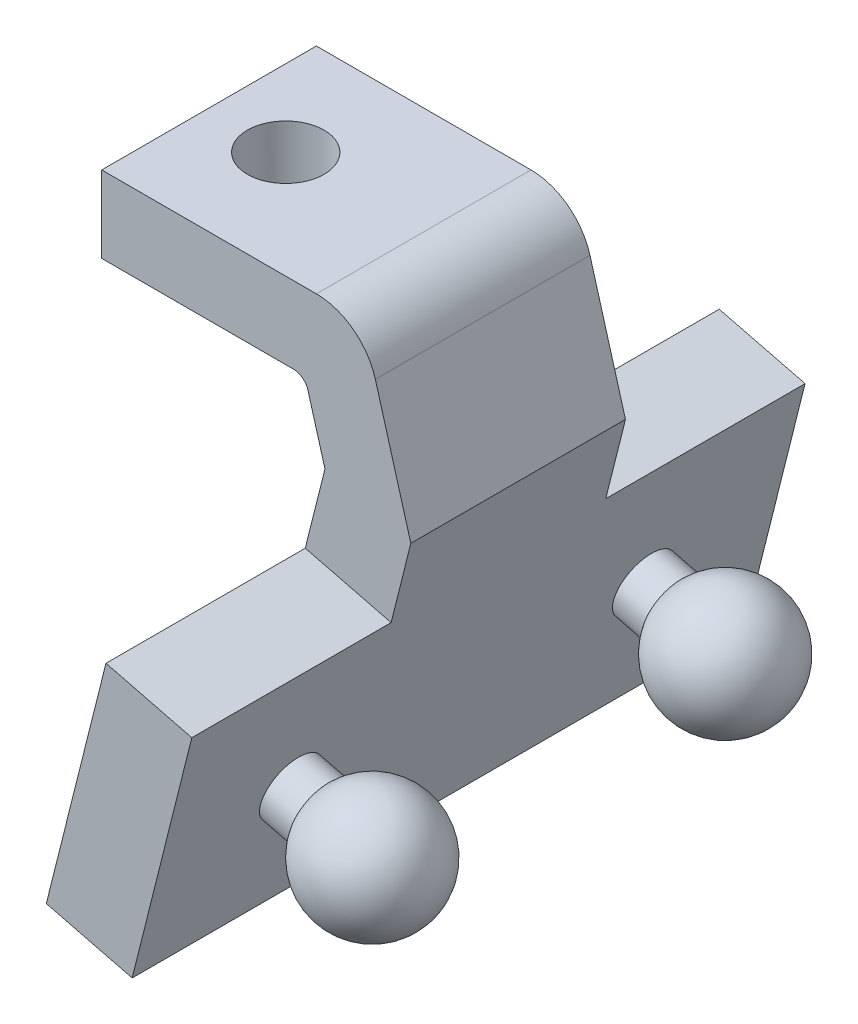
ISO-10303-21;
HEADER;
FILE_DESCRIPTION(('STEP AP214'),'2;1');
FILE_NAME('part.step','',(''),(''),'','','');
FILE_SCHEMA(('AUTOMOTIVE_DESIGN { 1 0 10303 214 1 1 1 1 }'));
ENDSEC;
DATA;
#1=APPLICATION_CONTEXT('core data for automotive mechanical design processes');
#2=APPLICATION_PROTOCOL_DEFINITION('international standard','automotive_design',2000,#1);
#3=PRODUCT_CONTEXT('',#1,'mechanical');
#4=PRODUCT('Part','Part','',(#3));
#5=PRODUCT_RELATED_PRODUCT_CATEGORY('part','',(#4));
#6=PRODUCT_DEFINITION_FORMATION('','',#4);
#7=PRODUCT_DEFINITION_CONTEXT('part definition',#1,'design');
#8=PRODUCT_DEFINITION('design','',#6,#7);
#9=PRODUCT_DEFINITION_SHAPE('','',#8);
#10=(LENGTH_UNIT() NAMED_UNIT(*) SI_UNIT(.MILLI.,.METRE.));
#11=(NAMED_UNIT(*) PLANE_ANGLE_UNIT() SI_UNIT($,.RADIAN.));
#12=(NAMED_UNIT(*) SI_UNIT($,.STERADIAN.) SOLID_ANGLE_UNIT());
#13=UNCERTAINTY_MEASURE_WITH_UNIT(LENGTH_MEASURE(1.E-05),#10,'distance_accuracy_value','');
#14=(GEOMETRIC_REPRESENTATION_CONTEXT(3) GLOBAL_UNCERTAINTY_ASSIGNED_CONTEXT((#13)) GLOBAL_UNIT_ASSIGNED_CONTEXT((#10,
#11,#12)) REPRESENTATION_CONTEXT('',''));
#15=CARTESIAN_POINT('',(0.,0.,0.));
#16=DIRECTION('',(0.,0.,1.));
#17=DIRECTION('',(1.,0.,0.));
#18=AXIS2_PLACEMENT_3D('',#15,#16,#17);
#19=CARTESIAN_POINT('',(0.,0.,3.5));
#20=DIRECTION('',(1.,0.,0.));
#21=DIRECTION('',(0.,0.,-1.));
#22=AXIS2_PLACEMENT_3D('',#19,#20,#21);
#23=PLANE('',#22);
#24=DIRECTION('',(0.,-1.,0.));
#25=VECTOR('',#24,1.);
#26=CARTESIAN_POINT('',(0.,0.,-3.5));
#27=LINE('',#26,#25);
#28=CARTESIAN_POINT('',(0.,2.5,-3.5));
#29=VERTEX_POINT('',#28);
#30=CARTESIAN_POINT('',(0.,0.,-3.5));
#31=VERTEX_POINT('',#30);
#32=EDGE_CURVE('E212',#29,#31,#27,.T.);
#33=ORIENTED_EDGE('',*,*,#32,.T.);
#34=DIRECTION('',(0.,0.,-1.));
#35=VECTOR('',#34,1.);
#36=CARTESIAN_POINT('',(0.,0.,3.5));
#37=LINE('',#36,#35);
#38=CARTESIAN_POINT('',(0.,0.,3.5));
#39=VERTEX_POINT('',#38);
#40=EDGE_CURVE('E252',#39,#31,#37,.T.);
#41=ORIENTED_EDGE('',*,*,#40,.F.);
#42=DIRECTION('',(0.,-1.,0.));
#43=VECTOR('',#42,1.);
#44=CARTESIAN_POINT('',(0.,0.,3.5));
#45=LINE('',#44,#43);
#46=CARTESIAN_POINT('',(0.,2.5,3.5));
#47=VERTEX_POINT('',#46);
#48=EDGE_CURVE('E192',#47,#39,#45,.T.);
#49=ORIENTED_EDGE('',*,*,#48,.F.);
#50=DIRECTION('',(0.,0.,-1.));
#51=VECTOR('',#50,1.);
#52=CARTESIAN_POINT('',(0.,2.5,3.5));
#53=LINE('',#52,#51);
#54=EDGE_CURVE('E211',#47,#29,#53,.T.);
#55=ORIENTED_EDGE('',*,*,#54,.T.);
#56=EDGE_LOOP('',(#33,#41,#49,#55));
#57=FACE_BOUND('',#56,.T.);
#58=ADVANCED_FACE('F41',(#57),#23,.F.);
#59=CARTESIAN_POINT('',(0.,0.,3.5));
#60=DIRECTION('',(0.,1.,0.));
#61=DIRECTION('',(0.,0.,1.));
#62=AXIS2_PLACEMENT_3D('',#59,#60,#61);
#63=PLANE('',#62);
#64=CARTESIAN_POINT('',(2.5,0.,0.));
#65=DIRECTION('',(0.,-1.,0.));
#66=DIRECTION('',(1.,0.,0.));
#67=AXIS2_PLACEMENT_3D('',#64,#65,#66);
#68=CIRCLE('',#67,1.25);
#69=CARTESIAN_POINT('',(3.75,0.,0.));
#70=VERTEX_POINT('',#69);
#71=EDGE_CURVE('E188',#70,#70,#68,.T.);
#72=ORIENTED_EDGE('',*,*,#71,.F.);
#73=EDGE_LOOP('',(#72));
#74=FACE_BOUND('',#73,.T.);
#75=DIRECTION('',(1.,0.,0.));
#76=VECTOR('',#75,1.);
#77=CARTESIAN_POINT('',(0.,0.,-3.5));
#78=LINE('',#77,#76);
#79=CARTESIAN_POINT('',(6.24543275290352,0.,-3.5));
#80=VERTEX_POINT('',#79);
#81=EDGE_CURVE('E215',#31,#80,#78,.T.);
#82=ORIENTED_EDGE('',*,*,#81,.T.);
#83=DIRECTION('',(0.,0.,-1.));
#84=VECTOR('',#83,1.);
#85=CARTESIAN_POINT('',(6.24543275290352,0.,3.5));
#86=LINE('',#85,#84);
#87=CARTESIAN_POINT('',(6.24543275290352,0.,3.5));
#88=VERTEX_POINT('',#87);
#89=EDGE_CURVE('E249',#88,#80,#86,.T.);
#90=ORIENTED_EDGE('',*,*,#89,.F.);
#91=DIRECTION('',(1.,0.,0.));
#92=VECTOR('',#91,1.);
#93=CARTESIAN_POINT('',(0.,0.,3.5));
#94=LINE('',#93,#92);
#95=EDGE_CURVE('E195',#39,#88,#94,.T.);
#96=ORIENTED_EDGE('',*,*,#95,.F.);
#97=ORIENTED_EDGE('',*,*,#40,.T.);
#98=EDGE_LOOP('',(#82,#90,#96,#97));
#99=FACE_BOUND('',#98,.T.);
#100=ADVANCED_FACE('F295',(#74,#99),#63,.F.);
#101=CARTESIAN_POINT('',(6.24543275290367,-0.5,3.5));
#102=DIRECTION('',(0.,0.,-1.));
#103=DIRECTION('',(-1.,0.,0.));
#104=AXIS2_PLACEMENT_3D('',#101,#102,#103);
#105=CYLINDRICAL_SURFACE('',#104,0.499999999999928);
#106=CARTESIAN_POINT('',(6.24543275290367,-0.5,-3.5));
#107=DIRECTION('',(0.,0.,-1.));
#108=DIRECTION('',(-1.,0.,0.));
#109=AXIS2_PLACEMENT_3D('',#106,#107,#108);
#110=CIRCLE('',#109,0.499999999999928);
#111=CARTESIAN_POINT('',(6.72624123981867,-0.362802336352115,-3.5));
#112=VERTEX_POINT('',#111);
#113=EDGE_CURVE('E217',#80,#112,#110,.T.);
#114=ORIENTED_EDGE('',*,*,#113,.T.);
#115=DIRECTION('',(0.,0.,-1.));
#116=VECTOR('',#115,1.);
#117=CARTESIAN_POINT('',(6.72624123981867,-0.362802336352115,3.5));
#118=LINE('',#117,#116);
#119=CARTESIAN_POINT('',(6.72624123981867,-0.362802336352115,3.5));
#120=VERTEX_POINT('',#119);
#121=EDGE_CURVE('E246',#120,#112,#118,.T.);
#122=ORIENTED_EDGE('',*,*,#121,.F.);
#123=CARTESIAN_POINT('',(6.24543275290367,-0.5,3.5));
#124=DIRECTION('',(0.,0.,-1.));
#125=DIRECTION('',(-1.,0.,0.));
#126=AXIS2_PLACEMENT_3D('',#123,#124,#125);
#127=CIRCLE('',#126,0.499999999999928);
#128=EDGE_CURVE('E198',#88,#120,#127,.T.);
#129=ORIENTED_EDGE('',*,*,#128,.F.);
#130=ORIENTED_EDGE('',*,*,#89,.T.);
#131=EDGE_LOOP('',(#114,#122,#129,#130));
#132=FACE_BOUND('',#131,.T.);
#133=ADVANCED_FACE('F291',(#132),#105,.F.);
#134=CARTESIAN_POINT('',(6.7262412398186,-0.362802336352134,3.5));
#135=DIRECTION('',(0.961616973830156,0.274395327295733,0.));
#136=DIRECTION('',(-0.274395327295733,0.961616973830156,0.));
#137=AXIS2_PLACEMENT_3D('',#134,#135,#136);
#138=PLANE('',#137);
#139=DIRECTION('',(0.274395327295733,-0.961616973830156,0.));
#140=VECTOR('',#139,1.);
#141=CARTESIAN_POINT('',(6.7262412398186,-0.362802336352134,-3.5));
#142=LINE('',#141,#140);
#143=CARTESIAN_POINT('',(7.28017081267278,-2.30404559589561,-3.5));
#144=VERTEX_POINT('',#143);
#145=EDGE_CURVE('E219',#112,#144,#142,.T.);
#146=ORIENTED_EDGE('',*,*,#145,.T.);
#147=DIRECTION('',(0.,0.,-1.));
#148=VECTOR('',#147,1.);
#149=CARTESIAN_POINT('',(7.28017081267278,-2.30404559589561,3.5));
#150=LINE('',#149,#148);
#151=CARTESIAN_POINT('',(7.28017081267278,-2.30404559589561,3.5));
#152=VERTEX_POINT('',#151);
#153=EDGE_CURVE('E244',#152,#144,#150,.T.);
#154=ORIENTED_EDGE('',*,*,#153,.F.);
#155=DIRECTION('',(0.274395327295733,-0.961616973830156,0.));
#156=VECTOR('',#155,1.);
#157=CARTESIAN_POINT('',(6.7262412398186,-0.362802336352134,3.5));
#158=LINE('',#157,#156);
#159=EDGE_CURVE('E200',#120,#152,#158,.T.);
#160=ORIENTED_EDGE('',*,*,#159,.F.);
#161=ORIENTED_EDGE('',*,*,#121,.T.);
#162=EDGE_LOOP('',(#146,#154,#160,#161));
#163=FACE_BOUND('',#162,.T.);
#164=ADVANCED_FACE('F286',(#163),#138,.F.);
#165=CARTESIAN_POINT('',(7.28017081267278,-2.30404559589561,3.5));
#166=DIRECTION('',(0.969982391695104,-0.243175162797203,0.));
#167=DIRECTION('',(0.243175162797203,0.969982391695104,0.));
#168=AXIS2_PLACEMENT_3D('',#165,#166,#167);
#169=PLANE('',#168);
#170=DIRECTION('',(-0.243175162797203,-0.969982391695104,0.));
#171=VECTOR('',#170,1.);
#172=CARTESIAN_POINT('',(7.28017081267278,-2.30404559589561,-3.5));
#173=LINE('',#172,#171);
#174=CARTESIAN_POINT('',(6.63821960289719,-4.86467457891787,-3.5));
#175=VERTEX_POINT('',#174);
#176=EDGE_CURVE('E159',#144,#175,#173,.T.);
#177=ORIENTED_EDGE('',*,*,#176,.T.);
#178=DIRECTION('',(0.,0.,1.));
#179=VECTOR('',#178,1.);
#180=CARTESIAN_POINT('',(6.63821960289719,-4.86467457891787,10.));
#181=LINE('',#180,#179);
#182=CARTESIAN_POINT('',(6.63821960289719,-4.86467457891787,-10.));
#183=VERTEX_POINT('',#182);
#184=EDGE_CURVE('E144',#183,#175,#181,.T.);
#185=ORIENTED_EDGE('',*,*,#184,.F.);
#186=DIRECTION('',(0.243175162797199,0.969982391695105,0.));
#187=VECTOR('',#186,1.);
#188=CARTESIAN_POINT('',(6.63821960289719,-4.86467457891787,-10.));
#189=LINE('',#188,#187);
#190=CARTESIAN_POINT('',(4.69281830051961,-12.6245337124787,-10.));
#191=VERTEX_POINT('',#190);
#192=EDGE_CURVE('E156',#191,#183,#189,.T.);
#193=ORIENTED_EDGE('',*,*,#192,.F.);
#194=DIRECTION('',(0.,0.,-1.));
#195=VECTOR('',#194,1.);
#196=CARTESIAN_POINT('',(4.69281830051958,-12.6245337124787,3.5));
#197=LINE('',#196,#195);
#198=CARTESIAN_POINT('',(4.69281830051961,-12.6245337124787,10.));
#199=VERTEX_POINT('',#198);
#200=EDGE_CURVE('E242',#199,#191,#197,.T.);
#201=ORIENTED_EDGE('',*,*,#200,.F.);
#202=DIRECTION('',(-0.243175162797199,-0.969982391695105,0.));
#203=VECTOR('',#202,1.);
#204=CARTESIAN_POINT('',(6.63821960289719,-4.86467457891787,10.));
#205=LINE('',#204,#203);
#206=CARTESIAN_POINT('',(6.63821960289719,-4.86467457891787,10.));
#207=VERTEX_POINT('',#206);
#208=EDGE_CURVE('E150',#207,#199,#205,.T.);
#209=ORIENTED_EDGE('',*,*,#208,.F.);
#210=CARTESIAN_POINT('',(6.63821960289721,-4.86467457891787,3.5));
#211=VERTEX_POINT('',#210);
#212=EDGE_CURVE('E160',#211,#207,#181,.T.);
#213=ORIENTED_EDGE('',*,*,#212,.F.);
#214=DIRECTION('',(-0.243175162797203,-0.969982391695104,0.));
#215=VECTOR('',#214,1.);
#216=CARTESIAN_POINT('',(7.28017081267278,-2.30404559589561,3.5));
#217=LINE('',#216,#215);
#218=EDGE_CURVE('E55',#152,#211,#217,.T.);
#219=ORIENTED_EDGE('',*,*,#218,.F.);
#220=ORIENTED_EDGE('',*,*,#153,.T.);
#221=EDGE_LOOP('',(#177,#185,#193,#201,#209,#213,#219,#220));
#222=FACE_BOUND('',#221,.T.);
#223=ADVANCED_FACE('F155',(#222),#169,.F.);
#224=CARTESIAN_POINT('',(4.69281830051958,-12.6245337124787,3.5));
#225=DIRECTION('',(0.243175162797193,0.969982391695106,0.));
#226=DIRECTION('',(-0.969982391695106,0.243175162797193,0.));
#227=AXIS2_PLACEMENT_3D('',#224,#225,#226);
#228=PLANE('',#227);
#229=ORIENTED_EDGE('',*,*,#200,.T.);
#230=DIRECTION('',(0.969982391695105,-0.243175162797199,0.));
#231=VECTOR('',#230,1.);
#232=CARTESIAN_POINT('',(4.69281830051961,-12.6245337124787,-10.));
#233=LINE('',#232,#231);
#234=CARTESIAN_POINT('',(7.49291627529145,-13.3265199409847,-10.));
#235=VERTEX_POINT('',#234);
#236=EDGE_CURVE('E165',#191,#235,#233,.T.);
#237=ORIENTED_EDGE('',*,*,#236,.T.);
#238=DIRECTION('',(0.,0.,-1.));
#239=VECTOR('',#238,1.);
#240=CARTESIAN_POINT('',(7.49291627529135,-13.3265199409847,3.5));
#241=LINE('',#240,#239);
#242=CARTESIAN_POINT('',(7.49291627529145,-13.3265199409847,10.));
#243=VERTEX_POINT('',#242);
#244=EDGE_CURVE('E240',#243,#235,#241,.T.);
#245=ORIENTED_EDGE('',*,*,#244,.F.);
#246=DIRECTION('',(0.969982391695105,-0.243175162797199,0.));
#247=VECTOR('',#246,1.);
#248=CARTESIAN_POINT('',(4.69281830051961,-12.6245337124787,10.));
#249=LINE('',#248,#247);
#250=EDGE_CURVE('E182',#199,#243,#249,.T.);
#251=ORIENTED_EDGE('',*,*,#250,.F.);
#252=EDGE_LOOP('',(#229,#237,#245,#251));
#253=FACE_BOUND('',#252,.T.);
#254=ADVANCED_FACE('F282',(#253),#228,.F.);
#255=CARTESIAN_POINT('',(7.49291627529135,-13.3265199409847,3.5));
#256=DIRECTION('',(-0.969982391695103,0.243175162797207,0.));
#257=DIRECTION('',(-0.243175162797207,-0.969982391695103,0.));
#258=AXIS2_PLACEMENT_3D('',#255,#256,#257);
#259=PLANE('',#258);
#260=CARTESIAN_POINT('',(8.42861500050508,-9.59418446334503,-5.75433763094816));
#261=DIRECTION('',(-0.969982391695105,0.243175162797199,0.));
#262=DIRECTION('',(0.243175162797199,0.969982391695105,0.));
#263=AXIS2_PLACEMENT_3D('',#260,#261,#262);
#264=CIRCLE('',#263,1.);
#265=CARTESIAN_POINT('',(8.67179016330228,-8.62420207164993,-5.75433763094816));
#266=VERTEX_POINT('',#265);
#267=EDGE_CURVE('E341',#266,#266,#264,.T.);
#268=ORIENTED_EDGE('',*,*,#267,.T.);
#269=EDGE_LOOP('',(#268));
#270=FACE_BOUND('',#269,.T.);
#271=CARTESIAN_POINT('',(8.42861500050502,-9.59418446334502,5.75433763094816));
#272=DIRECTION('',(-0.969982391695103,0.243175162797207,0.));
#273=DIRECTION('',(-0.243175162797207,-0.969982391695103,0.));
#274=AXIS2_PLACEMENT_3D('',#271,#272,#273);
#275=CIRCLE('',#274,1.);
#276=CARTESIAN_POINT('',(8.18543983770781,-10.5641668550401,5.75433763094816));
#277=VERTEX_POINT('',#276);
#278=EDGE_CURVE('E11',#277,#277,#275,.F.);
#279=ORIENTED_EDGE('',*,*,#278,.F.);
#280=EDGE_LOOP('',(#279));
#281=FACE_BOUND('',#280,.T.);
#282=DIRECTION('',(0.243175162797207,0.969982391695103,0.));
#283=VECTOR('',#282,1.);
#284=CARTESIAN_POINT('',(7.49291627529135,-13.3265199409847,3.5));
#285=LINE('',#284,#283);
#286=CARTESIAN_POINT('',(9.43831757766904,-5.56666080742384,3.5));
#287=VERTEX_POINT('',#286);
#288=CARTESIAN_POINT('',(10.0802687874446,-3.00603182440162,3.5));
#289=VERTEX_POINT('',#288);
#290=EDGE_CURVE('E203',#287,#289,#285,.T.);
#291=ORIENTED_EDGE('',*,*,#290,.F.);
#292=DIRECTION('',(0.,0.,1.));
#293=VECTOR('',#292,1.);
#294=CARTESIAN_POINT('',(9.43831757766904,-5.56666080742384,10.));
#295=LINE('',#294,#293);
#296=CARTESIAN_POINT('',(9.43831757766904,-5.56666080742384,10.));
#297=VERTEX_POINT('',#296);
#298=EDGE_CURVE('E178',#287,#297,#295,.T.);
#299=ORIENTED_EDGE('',*,*,#298,.T.);
#300=DIRECTION('',(-0.243175162797199,-0.969982391695105,0.));
#301=VECTOR('',#300,1.);
#302=CARTESIAN_POINT('',(9.43831757766904,-5.56666080742384,10.));
#303=LINE('',#302,#301);
#304=EDGE_CURVE('E166',#297,#243,#303,.T.);
#305=ORIENTED_EDGE('',*,*,#304,.T.);
#306=ORIENTED_EDGE('',*,*,#244,.T.);
#307=DIRECTION('',(0.243175162797199,0.969982391695105,0.));
#308=VECTOR('',#307,1.);
#309=CARTESIAN_POINT('',(9.43831757766904,-5.56666080742384,-10.));
#310=LINE('',#309,#308);
#311=CARTESIAN_POINT('',(9.43831757766904,-5.56666080742384,-10.));
#312=VERTEX_POINT('',#311);
#313=EDGE_CURVE('E176',#235,#312,#310,.T.);
#314=ORIENTED_EDGE('',*,*,#313,.T.);
#315=CARTESIAN_POINT('',(9.43831757766901,-5.56666080742383,-3.5));
#316=VERTEX_POINT('',#315);
#317=EDGE_CURVE('E63',#312,#316,#295,.T.);
#318=ORIENTED_EDGE('',*,*,#317,.T.);
#319=DIRECTION('',(0.243175162797207,0.969982391695103,0.));
#320=VECTOR('',#319,1.);
#321=CARTESIAN_POINT('',(7.49291627529135,-13.3265199409847,-3.5));
#322=LINE('',#321,#320);
#323=CARTESIAN_POINT('',(10.0802687874446,-3.00603182440162,-3.5));
#324=VERTEX_POINT('',#323);
#325=EDGE_CURVE('E222',#316,#324,#322,.T.);
#326=ORIENTED_EDGE('',*,*,#325,.T.);
#327=DIRECTION('',(0.,0.,-1.));
#328=VECTOR('',#327,1.);
#329=CARTESIAN_POINT('',(10.0802687874446,-3.00603182440162,3.5));
#330=LINE('',#329,#328);
#331=EDGE_CURVE('E237',#289,#324,#330,.T.);
#332=ORIENTED_EDGE('',*,*,#331,.F.);
#333=EDGE_LOOP('',(#291,#299,#305,#306,#314,#318,#326,#332));
#334=FACE_BOUND('',#333,.T.);
#335=ADVANCED_FACE('F263',(#270,#281,#334),#259,.F.);
#336=CARTESIAN_POINT('',(10.0802687874446,-3.00603182440162,3.5));
#337=DIRECTION('',(-0.961616973830156,-0.274395327295733,0.));
#338=DIRECTION('',(0.274395327295733,-0.961616973830156,0.));
#339=AXIS2_PLACEMENT_3D('',#336,#337,#338);
#340=PLANE('',#339);
#341=DIRECTION('',(-0.274395327295733,0.961616973830156,0.));
#342=VECTOR('',#341,1.);
#343=CARTESIAN_POINT('',(10.0802687874446,-3.00603182440162,-3.5));
#344=LINE('',#343,#342);
#345=CARTESIAN_POINT('',(8.92323394766031,1.04879065459147,-3.5));
#346=VERTEX_POINT('',#345);
#347=EDGE_CURVE('E224',#324,#346,#344,.T.);
#348=ORIENTED_EDGE('',*,*,#347,.T.);
#349=DIRECTION('',(0.,0.,-1.));
#350=VECTOR('',#349,1.);
#351=CARTESIAN_POINT('',(8.92323394766031,1.04879065459147,3.5));
#352=LINE('',#351,#350);
#353=CARTESIAN_POINT('',(8.92323394766031,1.04879065459147,3.5));
#354=VERTEX_POINT('',#353);
#355=EDGE_CURVE('E234',#354,#346,#352,.T.);
#356=ORIENTED_EDGE('',*,*,#355,.F.);
#357=DIRECTION('',(-0.274395327295733,0.961616973830156,0.));
#358=VECTOR('',#357,1.);
#359=CARTESIAN_POINT('',(10.0802687874446,-3.00603182440162,3.5));
#360=LINE('',#359,#358);
#361=EDGE_CURVE('E205',#289,#354,#360,.T.);
#362=ORIENTED_EDGE('',*,*,#361,.F.);
#363=ORIENTED_EDGE('',*,*,#331,.T.);
#364=EDGE_LOOP('',(#348,#356,#362,#363));
#365=FACE_BOUND('',#364,.T.);
#366=ADVANCED_FACE('F266',(#365),#340,.F.);
#367=CARTESIAN_POINT('',(7.,0.5,3.5));
#368=DIRECTION('',(0.,0.,-1.));
#369=DIRECTION('',(-1.,0.,0.));
#370=AXIS2_PLACEMENT_3D('',#367,#368,#369);
#371=CYLINDRICAL_SURFACE('',#370,2.);
#372=CARTESIAN_POINT('',(7.,0.5,-3.5));
#373=DIRECTION('',(0.,0.,1.));
#374=DIRECTION('',(1.,0.,0.));
#375=AXIS2_PLACEMENT_3D('',#372,#373,#374);
#376=CIRCLE('',#375,2.);
#377=CARTESIAN_POINT('',(7.,2.5,-3.5));
#378=VERTEX_POINT('',#377);
#379=EDGE_CURVE('E226',#346,#378,#376,.T.);
#380=ORIENTED_EDGE('',*,*,#379,.T.);
#381=DIRECTION('',(0.,0.,-1.));
#382=VECTOR('',#381,1.);
#383=CARTESIAN_POINT('',(7.,2.5,3.5));
#384=LINE('',#383,#382);
#385=CARTESIAN_POINT('',(7.,2.5,3.5));
#386=VERTEX_POINT('',#385);
#387=EDGE_CURVE('E231',#386,#378,#384,.T.);
#388=ORIENTED_EDGE('',*,*,#387,.F.);
#389=CARTESIAN_POINT('',(7.,0.5,3.5));
#390=DIRECTION('',(0.,0.,1.));
#391=DIRECTION('',(1.,0.,0.));
#392=AXIS2_PLACEMENT_3D('',#389,#390,#391);
#393=CIRCLE('',#392,2.);
#394=EDGE_CURVE('E207',#354,#386,#393,.T.);
#395=ORIENTED_EDGE('',*,*,#394,.F.);
#396=ORIENTED_EDGE('',*,*,#355,.T.);
#397=EDGE_LOOP('',(#380,#388,#395,#396));
#398=FACE_BOUND('',#397,.T.);
#399=ADVANCED_FACE('F305',(#398),#371,.T.);
#400=CARTESIAN_POINT('',(0.,2.5,3.5));
#401=DIRECTION('',(0.,-1.,0.));
#402=DIRECTION('',(0.,0.,-1.));
#403=AXIS2_PLACEMENT_3D('',#400,#401,#402);
#404=PLANE('',#403);
#405=CARTESIAN_POINT('',(2.5,2.5,0.));
#406=DIRECTION('',(0.,-1.,0.));
#407=DIRECTION('',(0.,0.,-1.));
#408=AXIS2_PLACEMENT_3D('',#405,#406,#407);
#409=CIRCLE('',#408,1.25);
#410=CARTESIAN_POINT('',(2.5,2.5,-1.25));
#411=VERTEX_POINT('',#410);
#412=EDGE_CURVE('E191',#411,#411,#409,.T.);
#413=ORIENTED_EDGE('',*,*,#412,.T.);
#414=EDGE_LOOP('',(#413));
#415=FACE_BOUND('',#414,.T.);
#416=DIRECTION('',(-1.,0.,0.));
#417=VECTOR('',#416,1.);
#418=CARTESIAN_POINT('',(0.,2.5,-3.5));
#419=LINE('',#418,#417);
#420=EDGE_CURVE('E196',#378,#29,#419,.T.);
#421=ORIENTED_EDGE('',*,*,#420,.T.);
#422=ORIENTED_EDGE('',*,*,#54,.F.);
#423=DIRECTION('',(-1.,0.,0.));
#424=VECTOR('',#423,1.);
#425=CARTESIAN_POINT('',(0.,2.5,3.5));
#426=LINE('',#425,#424);
#427=EDGE_CURVE('E209',#386,#47,#426,.T.);
#428=ORIENTED_EDGE('',*,*,#427,.F.);
#429=ORIENTED_EDGE('',*,*,#387,.T.);
#430=EDGE_LOOP('',(#421,#422,#428,#429));
#431=FACE_BOUND('',#430,.T.);
#432=ADVANCED_FACE('F302',(#415,#431),#404,.F.);
#433=CARTESIAN_POINT('',(7.,0.5,3.5));
#434=DIRECTION('',(0.,0.,1.));
#435=DIRECTION('',(1.,0.,0.));
#436=AXIS2_PLACEMENT_3D('',#433,#434,#435);
#437=PLANE('',#436);
#438=DIRECTION('',(-0.969982391695105,0.243175162797199,0.));
#439=VECTOR('',#438,1.);
#440=CARTESIAN_POINT('',(5.71321044553782,-4.63277423273049,3.5));
#441=LINE('',#440,#439);
#442=EDGE_CURVE('E181',#287,#211,#441,.T.);
#443=ORIENTED_EDGE('',*,*,#442,.F.);
#444=ORIENTED_EDGE('',*,*,#290,.T.);
#445=ORIENTED_EDGE('',*,*,#361,.T.);
#446=ORIENTED_EDGE('',*,*,#394,.T.);
#447=ORIENTED_EDGE('',*,*,#427,.T.);
#448=ORIENTED_EDGE('',*,*,#48,.T.);
#449=ORIENTED_EDGE('',*,*,#95,.T.);
#450=ORIENTED_EDGE('',*,*,#128,.T.);
#451=ORIENTED_EDGE('',*,*,#159,.T.);
#452=ORIENTED_EDGE('',*,*,#218,.T.);
#453=EDGE_LOOP('',(#443,#444,#445,#446,#447,#448,#449,#450,#451,#452));
#454=FACE_BOUND('',#453,.T.);
#455=ADVANCED_FACE('F269',(#454),#437,.T.);
#456=CARTESIAN_POINT('',(7.,0.5,-3.5));
#457=DIRECTION('',(0.,0.,1.));
#458=DIRECTION('',(1.,0.,0.));
#459=AXIS2_PLACEMENT_3D('',#456,#457,#458);
#460=PLANE('',#459);
#461=ORIENTED_EDGE('',*,*,#325,.F.);
#462=DIRECTION('',(-0.969982391695105,0.243175162797199,0.));
#463=VECTOR('',#462,1.);
#464=CARTESIAN_POINT('',(5.71321044553782,-4.63277423273049,-3.5));
#465=LINE('',#464,#463);
#466=EDGE_CURVE('E48',#316,#175,#465,.T.);
#467=ORIENTED_EDGE('',*,*,#466,.T.);
#468=ORIENTED_EDGE('',*,*,#176,.F.);
#469=ORIENTED_EDGE('',*,*,#145,.F.);
#470=ORIENTED_EDGE('',*,*,#113,.F.);
#471=ORIENTED_EDGE('',*,*,#81,.F.);
#472=ORIENTED_EDGE('',*,*,#32,.F.);
#473=ORIENTED_EDGE('',*,*,#420,.F.);
#474=ORIENTED_EDGE('',*,*,#379,.F.);
#475=ORIENTED_EDGE('',*,*,#347,.F.);
#476=EDGE_LOOP('',(#461,#467,#468,#469,#470,#471,#472,#473,#474,#475));
#477=FACE_BOUND('',#476,.T.);
#478=ADVANCED_FACE('F258',(#477),#460,.F.);
#479=CARTESIAN_POINT('',(2.5,5.5,0.));
#480=DIRECTION('',(0.,-1.,0.));
#481=DIRECTION('',(1.,0.,0.));
#482=AXIS2_PLACEMENT_3D('',#479,#480,#481);
#483=CYLINDRICAL_SURFACE('',#482,1.25);
#484=ORIENTED_EDGE('',*,*,#71,.T.);
#485=EDGE_LOOP('',(#484));
#486=FACE_BOUND('',#485,.T.);
#487=ORIENTED_EDGE('',*,*,#412,.F.);
#488=EDGE_LOOP('',(#487));
#489=FACE_BOUND('',#488,.T.);
#490=ADVANCED_FACE('F363',(#486,#489),#483,.F.);
#491=CARTESIAN_POINT('',(6.63821960289719,-4.86467457891787,-10.));
#492=DIRECTION('',(0.,0.,-1.));
#493=DIRECTION('',(-1.,0.,0.));
#494=AXIS2_PLACEMENT_3D('',#491,#492,#493);
#495=PLANE('',#494);
#496=ORIENTED_EDGE('',*,*,#313,.F.);
#497=ORIENTED_EDGE('',*,*,#236,.F.);
#498=ORIENTED_EDGE('',*,*,#192,.T.);
#499=DIRECTION('',(0.969982391695105,-0.243175162797199,0.));
#500=VECTOR('',#499,1.);
#501=CARTESIAN_POINT('',(6.63821960289719,-4.86467457891787,-10.));
#502=LINE('',#501,#500);
#503=EDGE_CURVE('E141',#183,#312,#502,.T.);
#504=ORIENTED_EDGE('',*,*,#503,.T.);
#505=EDGE_LOOP('',(#496,#497,#498,#504));
#506=FACE_BOUND('',#505,.T.);
#507=ADVANCED_FACE('F163',(#506),#495,.T.);
#508=CARTESIAN_POINT('',(6.63821960289719,-4.86467457891787,10.));
#509=DIRECTION('',(0.243175162797199,0.969982391695105,0.));
#510=DIRECTION('',(-0.969982391695105,0.243175162797199,0.));
#511=AXIS2_PLACEMENT_3D('',#508,#509,#510);
#512=PLANE('',#511);
#513=ORIENTED_EDGE('',*,*,#466,.F.);
#514=ORIENTED_EDGE('',*,*,#317,.F.);
#515=ORIENTED_EDGE('',*,*,#503,.F.);
#516=ORIENTED_EDGE('',*,*,#184,.T.);
#517=EDGE_LOOP('',(#513,#514,#515,#516));
#518=FACE_BOUND('',#517,.T.);
#519=ADVANCED_FACE('F143',(#518),#512,.T.);
#520=CARTESIAN_POINT('',(6.63821960289719,-4.86467457891787,10.));
#521=DIRECTION('',(0.,0.,1.));
#522=DIRECTION('',(0.,-1.,0.));
#523=AXIS2_PLACEMENT_3D('',#520,#521,#522);
#524=PLANE('',#523);
#525=ORIENTED_EDGE('',*,*,#304,.F.);
#526=DIRECTION('',(0.969982391695105,-0.243175162797199,0.));
#527=VECTOR('',#526,1.);
#528=CARTESIAN_POINT('',(6.63821960289719,-4.86467457891787,10.));
#529=LINE('',#528,#527);
#530=EDGE_CURVE('E149',#207,#297,#529,.T.);
#531=ORIENTED_EDGE('',*,*,#530,.F.);
#532=ORIENTED_EDGE('',*,*,#208,.T.);
#533=ORIENTED_EDGE('',*,*,#250,.T.);
#534=EDGE_LOOP('',(#525,#531,#532,#533));
#535=FACE_BOUND('',#534,.T.);
#536=ADVANCED_FACE('F279',(#535),#524,.T.);
#537=ORIENTED_EDGE('',*,*,#298,.F.);
#538=ORIENTED_EDGE('',*,*,#442,.T.);
#539=ORIENTED_EDGE('',*,*,#212,.T.);
#540=ORIENTED_EDGE('',*,*,#530,.T.);
#541=EDGE_LOOP('',(#537,#538,#539,#540));
#542=FACE_BOUND('',#541,.T.);
#543=ADVANCED_FACE('F275',(#542),#512,.T.);
#544=CARTESIAN_POINT('',(9.39859739220019,-9.83735962614223,5.75433763094816));
#545=DIRECTION('',(-0.969982391695105,0.243175162797199,0.));
#546=DIRECTION('',(-0.243175162797199,-0.969982391695105,0.));
#547=AXIS2_PLACEMENT_3D('',#544,#545,#546);
#548=CYLINDRICAL_SURFACE('',#547,1.);
#549=CARTESIAN_POINT('',(9.39859739220019,-9.83735962614223,5.75433763094816));
#550=DIRECTION('',(0.969982391695105,-0.243175162797199,0.));
#551=DIRECTION('',(0.243175162797199,0.969982391695105,0.));
#552=AXIS2_PLACEMENT_3D('',#549,#550,#551);
#553=CIRCLE('',#552,1.);
#554=CARTESIAN_POINT('',(9.64177255499739,-8.86737723444713,5.75433763094816));
#555=VERTEX_POINT('',#554);
#556=EDGE_CURVE('E171',#555,#555,#553,.T.);
#557=ORIENTED_EDGE('',*,*,#556,.F.);
#558=EDGE_LOOP('',(#557));
#559=FACE_BOUND('',#558,.T.);
#560=ORIENTED_EDGE('',*,*,#278,.T.);
#561=EDGE_LOOP('',(#560));
#562=FACE_BOUND('',#561,.T.);
#563=ADVANCED_FACE('F344',(#559,#562),#548,.T.);
#564=CARTESIAN_POINT('',(11.0786561770633,-10.2585513632458,5.75433763094816));
#565=DIRECTION('',(-0.969982391695105,0.243175162797199,0.));
#566=DIRECTION('',(0.,0.,1.));
#567=AXIS2_PLACEMENT_3D('',#564,#565,#566);
#568=SPHERICAL_SURFACE('',#567,2.);
#569=ORIENTED_EDGE('',*,*,#556,.T.);
#570=EDGE_LOOP('',(#569));
#571=FACE_BOUND('',#570,.T.);
#572=ADVANCED_FACE('F346',(#571),#568,.T.);
#573=CARTESIAN_POINT('',(9.39859739220019,-9.83735962614223,-5.75433763094816));
#574=DIRECTION('',(-0.969982391695105,0.243175162797199,0.));
#575=DIRECTION('',(-0.243175162797199,-0.969982391695105,0.));
#576=AXIS2_PLACEMENT_3D('',#573,#574,#575);
#577=CYLINDRICAL_SURFACE('',#576,1.);
#578=CARTESIAN_POINT('',(9.39859739220019,-9.83735962614224,-5.75433763094816));
#579=DIRECTION('',(0.969982391695105,-0.243175162797199,0.));
#580=DIRECTION('',(-0.243175162797199,-0.969982391695105,0.));
#581=AXIS2_PLACEMENT_3D('',#578,#579,#580);
#582=CIRCLE('',#581,0.999999999999999);
#583=CARTESIAN_POINT('',(9.15542222940299,-10.8073420178373,-5.75433763094816));
#584=VERTEX_POINT('',#583);
#585=EDGE_CURVE('E429',#584,#584,#582,.T.);
#586=ORIENTED_EDGE('',*,*,#585,.F.);
#587=EDGE_LOOP('',(#586));
#588=FACE_BOUND('',#587,.T.);
#589=ORIENTED_EDGE('',*,*,#267,.F.);
#590=EDGE_LOOP('',(#589));
#591=FACE_BOUND('',#590,.T.);
#592=ADVANCED_FACE('F352',(#588,#591),#577,.T.);
#593=CARTESIAN_POINT('',(11.0786561770633,-10.2585513632458,-5.75433763094816));
#594=DIRECTION('',(-0.969982391695105,0.243175162797199,0.));
#595=DIRECTION('',(0.,0.,-1.));
#596=AXIS2_PLACEMENT_3D('',#593,#594,#595);
#597=SPHERICAL_SURFACE('',#596,2.);
#598=ORIENTED_EDGE('',*,*,#585,.T.);
#599=EDGE_LOOP('',(#598));
#600=FACE_BOUND('',#599,.T.);
#601=ADVANCED_FACE('F415',(#600),#597,.T.);
#602=CLOSED_SHELL('',(#58,#100,#133,#164,#223,#254,#335,#366,#399,#432,#455,#478,#490,#507,#519,
#536,#543,#563,#572,#592,#601));
#603=MANIFOLD_SOLID_BREP('B2',#602);
#604=ADVANCED_BREP_SHAPE_REPRESENTATION('',(#18,#603),#14);
#605=SHAPE_DEFINITION_REPRESENTATION(#9,#604);
ENDSEC;
END-ISO-10303-21;
